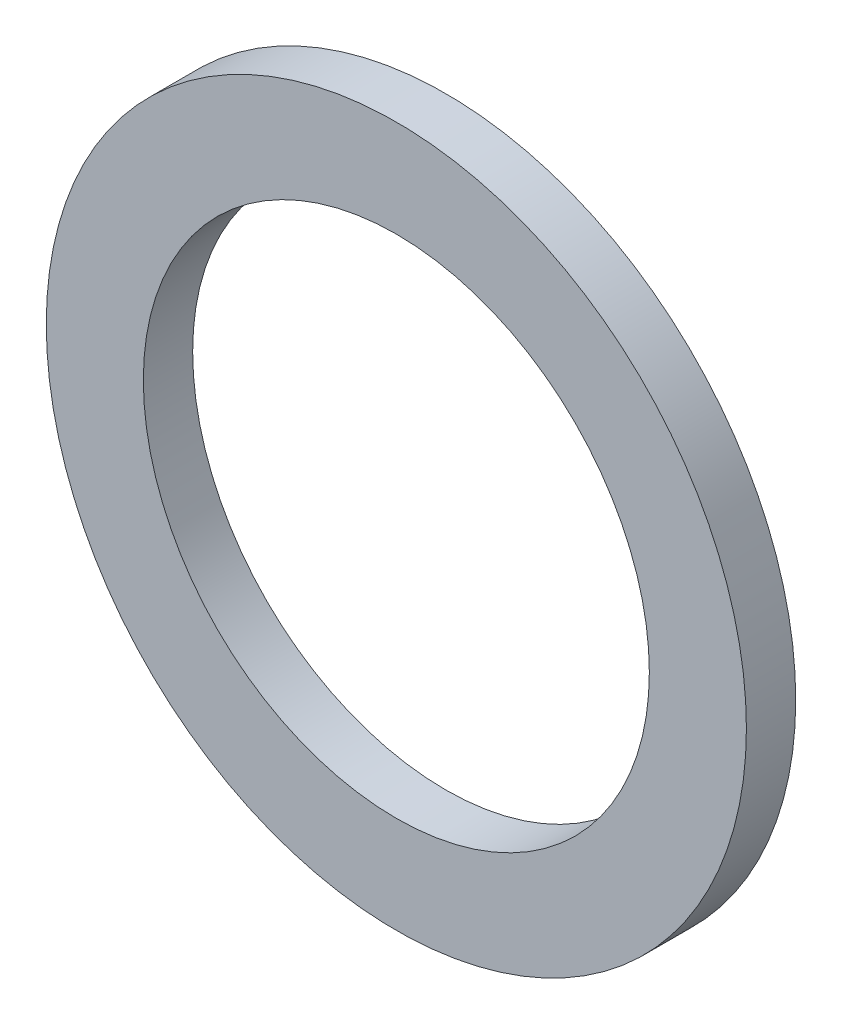
ISO-10303-21;
HEADER;
FILE_DESCRIPTION(('STEP AP214'),'2;1');
FILE_NAME('part.step','',(''),(''),'','','');
FILE_SCHEMA(('AUTOMOTIVE_DESIGN { 1 0 10303 214 1 1 1 1 }'));
ENDSEC;
DATA;
#1=APPLICATION_CONTEXT('core data for automotive mechanical design processes');
#2=APPLICATION_PROTOCOL_DEFINITION('international standard','automotive_design',2000,#1);
#3=PRODUCT_CONTEXT('',#1,'mechanical');
#4=PRODUCT('Part','Part','',(#3));
#5=PRODUCT_RELATED_PRODUCT_CATEGORY('part','',(#4));
#6=PRODUCT_DEFINITION_FORMATION('','',#4);
#7=PRODUCT_DEFINITION_CONTEXT('part definition',#1,'design');
#8=PRODUCT_DEFINITION('design','',#6,#7);
#9=PRODUCT_DEFINITION_SHAPE('','',#8);
#10=(LENGTH_UNIT() NAMED_UNIT(*) SI_UNIT(.MILLI.,.METRE.));
#11=(NAMED_UNIT(*) PLANE_ANGLE_UNIT() SI_UNIT($,.RADIAN.));
#12=(NAMED_UNIT(*) SI_UNIT($,.STERADIAN.) SOLID_ANGLE_UNIT());
#13=UNCERTAINTY_MEASURE_WITH_UNIT(LENGTH_MEASURE(1.E-05),#10,'distance_accuracy_value','');
#14=(GEOMETRIC_REPRESENTATION_CONTEXT(3) GLOBAL_UNCERTAINTY_ASSIGNED_CONTEXT((#13)) GLOBAL_UNIT_ASSIGNED_CONTEXT((#10,
#11,#12)) REPRESENTATION_CONTEXT('',''));
#15=CARTESIAN_POINT('',(0.,0.,0.));
#16=DIRECTION('',(0.,0.,1.));
#17=DIRECTION('',(1.,0.,0.));
#18=AXIS2_PLACEMENT_3D('',#15,#16,#17);
#19=CARTESIAN_POINT('',(0.,0.,0.7874));
#20=DIRECTION('',(0.,0.,1.));
#21=DIRECTION('',(1.,0.,0.));
#22=AXIS2_PLACEMENT_3D('',#19,#20,#21);
#23=PLANE('',#22);
#24=CARTESIAN_POINT('',(0.,0.,0.7874));
#25=DIRECTION('',(0.,0.,1.));
#26=DIRECTION('',(1.,0.,0.));
#27=AXIS2_PLACEMENT_3D('',#24,#25,#26);
#28=CIRCLE('',#27,5.588);
#29=CARTESIAN_POINT('',(5.588,0.,0.7874));
#30=VERTEX_POINT('',#29);
#31=EDGE_CURVE('E10',#30,#30,#28,.T.);
#32=ORIENTED_EDGE('',*,*,#31,.T.);
#33=EDGE_LOOP('',(#32));
#34=FACE_BOUND('',#33,.T.);
#35=CARTESIAN_POINT('',(0.,0.,0.7874));
#36=DIRECTION('',(0.,0.,1.));
#37=DIRECTION('',(1.,0.,0.));
#38=AXIS2_PLACEMENT_3D('',#35,#36,#37);
#39=CIRCLE('',#38,4.0386);
#40=CARTESIAN_POINT('',(4.0386,0.,0.7874));
#41=VERTEX_POINT('',#40);
#42=EDGE_CURVE('E42',#41,#41,#39,.T.);
#43=ORIENTED_EDGE('',*,*,#42,.F.);
#44=EDGE_LOOP('',(#43));
#45=FACE_BOUND('',#44,.T.);
#46=ADVANCED_FACE('F31',(#34,#45),#23,.T.);
#47=CARTESIAN_POINT('',(0.,0.,0.));
#48=DIRECTION('',(0.,0.,1.));
#49=DIRECTION('',(1.,0.,0.));
#50=AXIS2_PLACEMENT_3D('',#47,#48,#49);
#51=PLANE('',#50);
#52=CARTESIAN_POINT('',(0.,0.,0.));
#53=DIRECTION('',(0.,0.,1.));
#54=DIRECTION('',(1.,0.,0.));
#55=AXIS2_PLACEMENT_3D('',#52,#53,#54);
#56=CIRCLE('',#55,5.588);
#57=CARTESIAN_POINT('',(5.588,0.,0.));
#58=VERTEX_POINT('',#57);
#59=EDGE_CURVE('E38',#58,#58,#56,.T.);
#60=ORIENTED_EDGE('',*,*,#59,.F.);
#61=EDGE_LOOP('',(#60));
#62=FACE_BOUND('',#61,.T.);
#63=CARTESIAN_POINT('',(0.,0.,0.));
#64=DIRECTION('',(0.,0.,1.));
#65=DIRECTION('',(1.,0.,0.));
#66=AXIS2_PLACEMENT_3D('',#63,#64,#65);
#67=CIRCLE('',#66,4.0386);
#68=CARTESIAN_POINT('',(4.0386,0.,0.));
#69=VERTEX_POINT('',#68);
#70=EDGE_CURVE('E46',#69,#69,#67,.T.);
#71=ORIENTED_EDGE('',*,*,#70,.T.);
#72=EDGE_LOOP('',(#71));
#73=FACE_BOUND('',#72,.T.);
#74=ADVANCED_FACE('F52',(#62,#73),#51,.F.);
#75=CARTESIAN_POINT('',(0.,0.,0.7874));
#76=DIRECTION('',(0.,0.,-1.));
#77=DIRECTION('',(-1.,0.,0.));
#78=AXIS2_PLACEMENT_3D('',#75,#76,#77);
#79=CYLINDRICAL_SURFACE('',#78,5.588);
#80=ORIENTED_EDGE('',*,*,#31,.F.);
#81=EDGE_LOOP('',(#80));
#82=FACE_BOUND('',#81,.T.);
#83=ORIENTED_EDGE('',*,*,#59,.T.);
#84=EDGE_LOOP('',(#83));
#85=FACE_BOUND('',#84,.T.);
#86=ADVANCED_FACE('F33',(#82,#85),#79,.T.);
#87=CARTESIAN_POINT('',(0.,0.,0.7874));
#88=DIRECTION('',(0.,0.,-1.));
#89=DIRECTION('',(-1.,0.,0.));
#90=AXIS2_PLACEMENT_3D('',#87,#88,#89);
#91=CYLINDRICAL_SURFACE('',#90,4.0386);
#92=ORIENTED_EDGE('',*,*,#42,.T.);
#93=EDGE_LOOP('',(#92));
#94=FACE_BOUND('',#93,.T.);
#95=ORIENTED_EDGE('',*,*,#70,.F.);
#96=EDGE_LOOP('',(#95));
#97=FACE_BOUND('',#96,.T.);
#98=ADVANCED_FACE('F54',(#94,#97),#91,.F.);
#99=CLOSED_SHELL('',(#46,#74,#86,#98));
#100=MANIFOLD_SOLID_BREP('B2',#99);
#101=ADVANCED_BREP_SHAPE_REPRESENTATION('',(#18,#100),#14);
#102=SHAPE_DEFINITION_REPRESENTATION(#9,#101);
ENDSEC;
END-ISO-10303-21;
